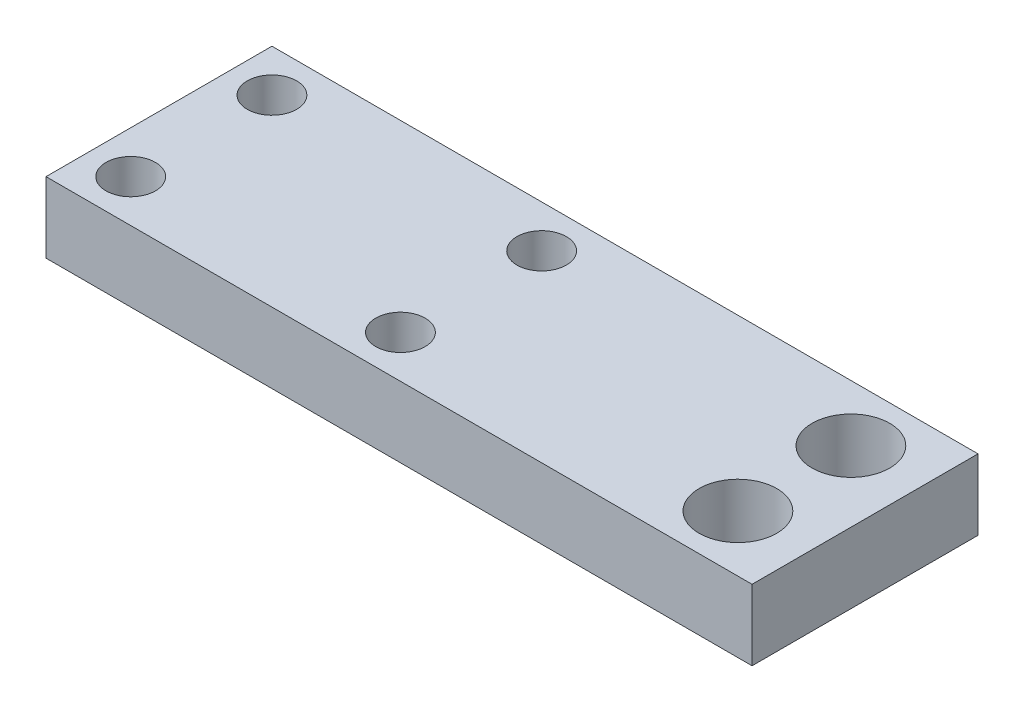
ISO-10303-21;
HEADER;
FILE_DESCRIPTION(('STEP AP214'),'2;1');
FILE_NAME('part.step','',(''),(''),'','','');
FILE_SCHEMA(('AUTOMOTIVE_DESIGN { 1 0 10303 214 1 1 1 1 }'));
ENDSEC;
DATA;
#1=APPLICATION_CONTEXT('core data for automotive mechanical design processes');
#2=APPLICATION_PROTOCOL_DEFINITION('international standard','automotive_design',2000,#1);
#3=PRODUCT_CONTEXT('',#1,'mechanical');
#4=PRODUCT('Part','Part','',(#3));
#5=PRODUCT_RELATED_PRODUCT_CATEGORY('part','',(#4));
#6=PRODUCT_DEFINITION_FORMATION('','',#4);
#7=PRODUCT_DEFINITION_CONTEXT('part definition',#1,'design');
#8=PRODUCT_DEFINITION('design','',#6,#7);
#9=PRODUCT_DEFINITION_SHAPE('','',#8);
#10=(LENGTH_UNIT() NAMED_UNIT(*) SI_UNIT(.MILLI.,.METRE.));
#11=(NAMED_UNIT(*) PLANE_ANGLE_UNIT() SI_UNIT($,.RADIAN.));
#12=(NAMED_UNIT(*) SI_UNIT($,.STERADIAN.) SOLID_ANGLE_UNIT());
#13=UNCERTAINTY_MEASURE_WITH_UNIT(LENGTH_MEASURE(1.E-05),#10,'distance_accuracy_value','');
#14=(GEOMETRIC_REPRESENTATION_CONTEXT(3) GLOBAL_UNCERTAINTY_ASSIGNED_CONTEXT((#13)) GLOBAL_UNIT_ASSIGNED_CONTEXT((#10,
#11,#12)) REPRESENTATION_CONTEXT('',''));
#15=CARTESIAN_POINT('',(0.,0.,0.));
#16=DIRECTION('',(0.,0.,1.));
#17=DIRECTION('',(1.,0.,0.));
#18=AXIS2_PLACEMENT_3D('',#15,#16,#17);
#19=CARTESIAN_POINT('',(0.,5.,0.));
#20=DIRECTION('',(0.,-1.,0.));
#21=DIRECTION('',(0.,0.,-1.));
#22=AXIS2_PLACEMENT_3D('',#19,#20,#21);
#23=PLANE('',#22);
#24=DIRECTION('',(0.,0.,1.));
#25=VECTOR('',#24,1.);
#26=CARTESIAN_POINT('',(-25.,5.,-8.));
#27=LINE('',#26,#25);
#28=CARTESIAN_POINT('',(-25.,5.,-8.));
#29=VERTEX_POINT('',#28);
#30=CARTESIAN_POINT('',(-25.,5.,8.));
#31=VERTEX_POINT('',#30);
#32=EDGE_CURVE('E69',#29,#31,#27,.T.);
#33=ORIENTED_EDGE('',*,*,#32,.T.);
#34=DIRECTION('',(1.,0.,0.));
#35=VECTOR('',#34,1.);
#36=CARTESIAN_POINT('',(25.,5.,8.));
#37=LINE('',#36,#35);
#38=CARTESIAN_POINT('',(25.,5.,8.));
#39=VERTEX_POINT('',#38);
#40=EDGE_CURVE('E64',#31,#39,#37,.T.);
#41=ORIENTED_EDGE('',*,*,#40,.T.);
#42=DIRECTION('',(0.,0.,-1.));
#43=VECTOR('',#42,1.);
#44=CARTESIAN_POINT('',(25.,5.,-8.));
#45=LINE('',#44,#43);
#46=CARTESIAN_POINT('',(25.,5.,-8.));
#47=VERTEX_POINT('',#46);
#48=EDGE_CURVE('E67',#39,#47,#45,.T.);
#49=ORIENTED_EDGE('',*,*,#48,.T.);
#50=DIRECTION('',(-1.,0.,0.));
#51=VECTOR('',#50,1.);
#52=CARTESIAN_POINT('',(25.,5.,-8.));
#53=LINE('',#52,#51);
#54=EDGE_CURVE('E34',#47,#29,#53,.T.);
#55=ORIENTED_EDGE('',*,*,#54,.T.);
#56=EDGE_LOOP('',(#33,#41,#49,#55));
#57=FACE_BOUND('',#56,.T.);
#58=CARTESIAN_POINT('',(20.,5.,4.));
#59=DIRECTION('',(0.,1.,0.));
#60=DIRECTION('',(0.,0.,1.));
#61=AXIS2_PLACEMENT_3D('',#58,#59,#60);
#62=CIRCLE('',#61,2.75);
#63=CARTESIAN_POINT('',(20.,5.,6.75));
#64=VERTEX_POINT('',#63);
#65=EDGE_CURVE('E84',#64,#64,#62,.T.);
#66=ORIENTED_EDGE('',*,*,#65,.F.);
#67=EDGE_LOOP('',(#66));
#68=FACE_BOUND('',#67,.T.);
#69=CARTESIAN_POINT('',(20.,5.,-4.));
#70=DIRECTION('',(0.,1.,0.));
#71=DIRECTION('',(0.,0.,1.));
#72=AXIS2_PLACEMENT_3D('',#69,#70,#71);
#73=CIRCLE('',#72,2.75);
#74=CARTESIAN_POINT('',(20.,5.,-1.25));
#75=VERTEX_POINT('',#74);
#76=EDGE_CURVE('E99',#75,#75,#73,.T.);
#77=ORIENTED_EDGE('',*,*,#76,.F.);
#78=EDGE_LOOP('',(#77));
#79=FACE_BOUND('',#78,.T.);
#80=CARTESIAN_POINT('',(-2.9,5.,5.));
#81=DIRECTION('',(0.,1.,0.));
#82=DIRECTION('',(0.,0.,-1.));
#83=AXIS2_PLACEMENT_3D('',#80,#81,#82);
#84=CIRCLE('',#83,1.75);
#85=CARTESIAN_POINT('',(-2.9,5.,3.25));
#86=VERTEX_POINT('',#85);
#87=EDGE_CURVE('E105',#86,#86,#84,.T.);
#88=ORIENTED_EDGE('',*,*,#87,.F.);
#89=EDGE_LOOP('',(#88));
#90=FACE_BOUND('',#89,.T.);
#91=CARTESIAN_POINT('',(-22.,5.,-5.));
#92=DIRECTION('',(0.,1.,0.));
#93=DIRECTION('',(0.,0.,1.));
#94=AXIS2_PLACEMENT_3D('',#91,#92,#93);
#95=CIRCLE('',#94,1.75);
#96=CARTESIAN_POINT('',(-22.,5.,-3.25));
#97=VERTEX_POINT('',#96);
#98=EDGE_CURVE('E111',#97,#97,#95,.T.);
#99=ORIENTED_EDGE('',*,*,#98,.F.);
#100=EDGE_LOOP('',(#99));
#101=FACE_BOUND('',#100,.T.);
#102=CARTESIAN_POINT('',(-2.9,5.,-5.));
#103=DIRECTION('',(0.,1.,0.));
#104=DIRECTION('',(0.,0.,1.));
#105=AXIS2_PLACEMENT_3D('',#102,#103,#104);
#106=CIRCLE('',#105,1.75);
#107=CARTESIAN_POINT('',(-2.9,5.,-3.25));
#108=VERTEX_POINT('',#107);
#109=EDGE_CURVE('E117',#108,#108,#106,.T.);
#110=ORIENTED_EDGE('',*,*,#109,.F.);
#111=EDGE_LOOP('',(#110));
#112=FACE_BOUND('',#111,.T.);
#113=CARTESIAN_POINT('',(-22.,5.,5.));
#114=DIRECTION('',(0.,1.,0.));
#115=DIRECTION('',(0.,0.,-1.));
#116=AXIS2_PLACEMENT_3D('',#113,#114,#115);
#117=CIRCLE('',#116,1.75);
#118=CARTESIAN_POINT('',(-22.,5.,3.25));
#119=VERTEX_POINT('',#118);
#120=EDGE_CURVE('E123',#119,#119,#117,.T.);
#121=ORIENTED_EDGE('',*,*,#120,.F.);
#122=EDGE_LOOP('',(#121));
#123=FACE_BOUND('',#122,.T.);
#124=ADVANCED_FACE('F17',(#57,#68,#79,#90,#101,#112,#123),#23,.F.);
#125=CARTESIAN_POINT('',(0.,0.,0.));
#126=DIRECTION('',(0.,-1.,0.));
#127=DIRECTION('',(0.,0.,-1.));
#128=AXIS2_PLACEMENT_3D('',#125,#126,#127);
#129=PLANE('',#128);
#130=CARTESIAN_POINT('',(-2.9,0.,-5.));
#131=DIRECTION('',(0.,1.,0.));
#132=DIRECTION('',(0.,0.,1.));
#133=AXIS2_PLACEMENT_3D('',#130,#131,#132);
#134=CIRCLE('',#133,1.75);
#135=CARTESIAN_POINT('',(-2.9,0.,-3.25));
#136=VERTEX_POINT('',#135);
#137=EDGE_CURVE('E120',#136,#136,#134,.T.);
#138=ORIENTED_EDGE('',*,*,#137,.T.);
#139=EDGE_LOOP('',(#138));
#140=FACE_BOUND('',#139,.T.);
#141=CARTESIAN_POINT('',(-2.9,0.,5.));
#142=DIRECTION('',(0.,1.,0.));
#143=DIRECTION('',(0.,0.,-1.));
#144=AXIS2_PLACEMENT_3D('',#141,#142,#143);
#145=CIRCLE('',#144,1.75);
#146=CARTESIAN_POINT('',(-2.9,0.,3.25));
#147=VERTEX_POINT('',#146);
#148=EDGE_CURVE('E108',#147,#147,#145,.T.);
#149=ORIENTED_EDGE('',*,*,#148,.T.);
#150=EDGE_LOOP('',(#149));
#151=FACE_BOUND('',#150,.T.);
#152=CARTESIAN_POINT('',(20.,0.,4.));
#153=DIRECTION('',(0.,1.,0.));
#154=DIRECTION('',(0.,0.,1.));
#155=AXIS2_PLACEMENT_3D('',#152,#153,#154);
#156=CIRCLE('',#155,2.75);
#157=CARTESIAN_POINT('',(20.,0.,6.75));
#158=VERTEX_POINT('',#157);
#159=EDGE_CURVE('E96',#158,#158,#156,.T.);
#160=ORIENTED_EDGE('',*,*,#159,.T.);
#161=EDGE_LOOP('',(#160));
#162=FACE_BOUND('',#161,.T.);
#163=DIRECTION('',(0.,0.,1.));
#164=VECTOR('',#163,1.);
#165=CARTESIAN_POINT('',(-25.,0.,-8.));
#166=LINE('',#165,#164);
#167=CARTESIAN_POINT('',(-25.,0.,-8.));
#168=VERTEX_POINT('',#167);
#169=CARTESIAN_POINT('',(-25.,0.,8.));
#170=VERTEX_POINT('',#169);
#171=EDGE_CURVE('E81',#168,#170,#166,.T.);
#172=ORIENTED_EDGE('',*,*,#171,.F.);
#173=DIRECTION('',(-1.,0.,0.));
#174=VECTOR('',#173,1.);
#175=CARTESIAN_POINT('',(25.,0.,-8.));
#176=LINE('',#175,#174);
#177=CARTESIAN_POINT('',(25.,0.,-8.));
#178=VERTEX_POINT('',#177);
#179=EDGE_CURVE('E57',#178,#168,#176,.T.);
#180=ORIENTED_EDGE('',*,*,#179,.F.);
#181=DIRECTION('',(0.,0.,-1.));
#182=VECTOR('',#181,1.);
#183=CARTESIAN_POINT('',(25.,0.,-8.));
#184=LINE('',#183,#182);
#185=CARTESIAN_POINT('',(25.,0.,8.));
#186=VERTEX_POINT('',#185);
#187=EDGE_CURVE('E51',#186,#178,#184,.T.);
#188=ORIENTED_EDGE('',*,*,#187,.F.);
#189=DIRECTION('',(1.,0.,0.));
#190=VECTOR('',#189,1.);
#191=CARTESIAN_POINT('',(25.,0.,8.));
#192=LINE('',#191,#190);
#193=EDGE_CURVE('E73',#170,#186,#192,.T.);
#194=ORIENTED_EDGE('',*,*,#193,.F.);
#195=EDGE_LOOP('',(#172,#180,#188,#194));
#196=FACE_BOUND('',#195,.T.);
#197=CARTESIAN_POINT('',(20.,0.,-4.));
#198=DIRECTION('',(0.,1.,0.));
#199=DIRECTION('',(0.,0.,1.));
#200=AXIS2_PLACEMENT_3D('',#197,#198,#199);
#201=CIRCLE('',#200,2.75);
#202=CARTESIAN_POINT('',(20.,0.,-1.25));
#203=VERTEX_POINT('',#202);
#204=EDGE_CURVE('E102',#203,#203,#201,.T.);
#205=ORIENTED_EDGE('',*,*,#204,.T.);
#206=EDGE_LOOP('',(#205));
#207=FACE_BOUND('',#206,.T.);
#208=CARTESIAN_POINT('',(-22.,0.,-5.));
#209=DIRECTION('',(0.,1.,0.));
#210=DIRECTION('',(0.,0.,1.));
#211=AXIS2_PLACEMENT_3D('',#208,#209,#210);
#212=CIRCLE('',#211,1.75);
#213=CARTESIAN_POINT('',(-22.,0.,-3.25));
#214=VERTEX_POINT('',#213);
#215=EDGE_CURVE('E114',#214,#214,#212,.T.);
#216=ORIENTED_EDGE('',*,*,#215,.T.);
#217=EDGE_LOOP('',(#216));
#218=FACE_BOUND('',#217,.T.);
#219=CARTESIAN_POINT('',(-22.,0.,5.));
#220=DIRECTION('',(0.,1.,0.));
#221=DIRECTION('',(0.,0.,-1.));
#222=AXIS2_PLACEMENT_3D('',#219,#220,#221);
#223=CIRCLE('',#222,1.75);
#224=CARTESIAN_POINT('',(-22.,0.,3.25));
#225=VERTEX_POINT('',#224);
#226=EDGE_CURVE('E126',#225,#225,#223,.T.);
#227=ORIENTED_EDGE('',*,*,#226,.T.);
#228=EDGE_LOOP('',(#227));
#229=FACE_BOUND('',#228,.T.);
#230=ADVANCED_FACE('F92',(#140,#151,#162,#196,#207,#218,#229),#129,.T.);
#231=CARTESIAN_POINT('',(-25.,5.,-8.));
#232=DIRECTION('',(1.,0.,0.));
#233=DIRECTION('',(0.,0.,-1.));
#234=AXIS2_PLACEMENT_3D('',#231,#232,#233);
#235=PLANE('',#234);
#236=ORIENTED_EDGE('',*,*,#171,.T.);
#237=DIRECTION('',(0.,-1.,0.));
#238=VECTOR('',#237,1.);
#239=CARTESIAN_POINT('',(-25.,5.,8.));
#240=LINE('',#239,#238);
#241=EDGE_CURVE('E11',#31,#170,#240,.T.);
#242=ORIENTED_EDGE('',*,*,#241,.F.);
#243=ORIENTED_EDGE('',*,*,#32,.F.);
#244=DIRECTION('',(0.,-1.,0.));
#245=VECTOR('',#244,1.);
#246=CARTESIAN_POINT('',(-25.,5.,-8.));
#247=LINE('',#246,#245);
#248=EDGE_CURVE('E77',#29,#168,#247,.T.);
#249=ORIENTED_EDGE('',*,*,#248,.T.);
#250=EDGE_LOOP('',(#236,#242,#243,#249));
#251=FACE_BOUND('',#250,.T.);
#252=ADVANCED_FACE('F19',(#251),#235,.F.);
#253=CARTESIAN_POINT('',(25.,5.,8.));
#254=DIRECTION('',(0.,0.,-1.));
#255=DIRECTION('',(-1.,0.,0.));
#256=AXIS2_PLACEMENT_3D('',#253,#254,#255);
#257=PLANE('',#256);
#258=ORIENTED_EDGE('',*,*,#193,.T.);
#259=DIRECTION('',(0.,-1.,0.));
#260=VECTOR('',#259,1.);
#261=CARTESIAN_POINT('',(25.,5.,8.));
#262=LINE('',#261,#260);
#263=EDGE_CURVE('E26',#39,#186,#262,.T.);
#264=ORIENTED_EDGE('',*,*,#263,.F.);
#265=ORIENTED_EDGE('',*,*,#40,.F.);
#266=ORIENTED_EDGE('',*,*,#241,.T.);
#267=EDGE_LOOP('',(#258,#264,#265,#266));
#268=FACE_BOUND('',#267,.T.);
#269=ADVANCED_FACE('F72',(#268),#257,.F.);
#270=CARTESIAN_POINT('',(25.,5.,-8.));
#271=DIRECTION('',(-1.,0.,0.));
#272=DIRECTION('',(0.,0.,1.));
#273=AXIS2_PLACEMENT_3D('',#270,#271,#272);
#274=PLANE('',#273);
#275=ORIENTED_EDGE('',*,*,#187,.T.);
#276=DIRECTION('',(0.,-1.,0.));
#277=VECTOR('',#276,1.);
#278=CARTESIAN_POINT('',(25.,5.,-8.));
#279=LINE('',#278,#277);
#280=EDGE_CURVE('E74',#47,#178,#279,.T.);
#281=ORIENTED_EDGE('',*,*,#280,.F.);
#282=ORIENTED_EDGE('',*,*,#48,.F.);
#283=ORIENTED_EDGE('',*,*,#263,.T.);
#284=EDGE_LOOP('',(#275,#281,#282,#283));
#285=FACE_BOUND('',#284,.T.);
#286=ADVANCED_FACE('F75',(#285),#274,.F.);
#287=CARTESIAN_POINT('',(25.,5.,-8.));
#288=DIRECTION('',(0.,0.,1.));
#289=DIRECTION('',(1.,0.,0.));
#290=AXIS2_PLACEMENT_3D('',#287,#288,#289);
#291=PLANE('',#290);
#292=ORIENTED_EDGE('',*,*,#179,.T.);
#293=ORIENTED_EDGE('',*,*,#248,.F.);
#294=ORIENTED_EDGE('',*,*,#54,.F.);
#295=ORIENTED_EDGE('',*,*,#280,.T.);
#296=EDGE_LOOP('',(#292,#293,#294,#295));
#297=FACE_BOUND('',#296,.T.);
#298=ADVANCED_FACE('F89',(#297),#291,.F.);
#299=CARTESIAN_POINT('',(20.,5.,4.));
#300=DIRECTION('',(0.,-1.,0.));
#301=DIRECTION('',(0.,0.,-1.));
#302=AXIS2_PLACEMENT_3D('',#299,#300,#301);
#303=CYLINDRICAL_SURFACE('',#302,2.75);
#304=ORIENTED_EDGE('',*,*,#65,.T.);
#305=EDGE_LOOP('',(#304));
#306=FACE_BOUND('',#305,.T.);
#307=ORIENTED_EDGE('',*,*,#159,.F.);
#308=EDGE_LOOP('',(#307));
#309=FACE_BOUND('',#308,.T.);
#310=ADVANCED_FACE('F145',(#306,#309),#303,.F.);
#311=CARTESIAN_POINT('',(20.,5.,-4.));
#312=DIRECTION('',(0.,-1.,0.));
#313=DIRECTION('',(0.,0.,-1.));
#314=AXIS2_PLACEMENT_3D('',#311,#312,#313);
#315=CYLINDRICAL_SURFACE('',#314,2.75);
#316=ORIENTED_EDGE('',*,*,#76,.T.);
#317=EDGE_LOOP('',(#316));
#318=FACE_BOUND('',#317,.T.);
#319=ORIENTED_EDGE('',*,*,#204,.F.);
#320=EDGE_LOOP('',(#319));
#321=FACE_BOUND('',#320,.T.);
#322=ADVANCED_FACE('F194',(#318,#321),#315,.F.);
#323=CARTESIAN_POINT('',(-2.9,5.,5.));
#324=DIRECTION('',(0.,-1.,0.));
#325=DIRECTION('',(0.,0.,-1.));
#326=AXIS2_PLACEMENT_3D('',#323,#324,#325);
#327=CYLINDRICAL_SURFACE('',#326,1.75);
#328=ORIENTED_EDGE('',*,*,#87,.T.);
#329=EDGE_LOOP('',(#328));
#330=FACE_BOUND('',#329,.T.);
#331=ORIENTED_EDGE('',*,*,#148,.F.);
#332=EDGE_LOOP('',(#331));
#333=FACE_BOUND('',#332,.T.);
#334=ADVANCED_FACE('F201',(#330,#333),#327,.F.);
#335=CARTESIAN_POINT('',(-22.,5.,-5.));
#336=DIRECTION('',(0.,-1.,0.));
#337=DIRECTION('',(0.,0.,-1.));
#338=AXIS2_PLACEMENT_3D('',#335,#336,#337);
#339=CYLINDRICAL_SURFACE('',#338,1.75);
#340=ORIENTED_EDGE('',*,*,#98,.T.);
#341=EDGE_LOOP('',(#340));
#342=FACE_BOUND('',#341,.T.);
#343=ORIENTED_EDGE('',*,*,#215,.F.);
#344=EDGE_LOOP('',(#343));
#345=FACE_BOUND('',#344,.T.);
#346=ADVANCED_FACE('F208',(#342,#345),#339,.F.);
#347=CARTESIAN_POINT('',(-2.9,5.,-5.));
#348=DIRECTION('',(0.,-1.,0.));
#349=DIRECTION('',(0.,0.,-1.));
#350=AXIS2_PLACEMENT_3D('',#347,#348,#349);
#351=CYLINDRICAL_SURFACE('',#350,1.75);
#352=ORIENTED_EDGE('',*,*,#109,.T.);
#353=EDGE_LOOP('',(#352));
#354=FACE_BOUND('',#353,.T.);
#355=ORIENTED_EDGE('',*,*,#137,.F.);
#356=EDGE_LOOP('',(#355));
#357=FACE_BOUND('',#356,.T.);
#358=ADVANCED_FACE('F216',(#354,#357),#351,.F.);
#359=CARTESIAN_POINT('',(-22.,5.,5.));
#360=DIRECTION('',(0.,-1.,0.));
#361=DIRECTION('',(0.,0.,-1.));
#362=AXIS2_PLACEMENT_3D('',#359,#360,#361);
#363=CYLINDRICAL_SURFACE('',#362,1.75);
#364=ORIENTED_EDGE('',*,*,#120,.T.);
#365=EDGE_LOOP('',(#364));
#366=FACE_BOUND('',#365,.T.);
#367=ORIENTED_EDGE('',*,*,#226,.F.);
#368=EDGE_LOOP('',(#367));
#369=FACE_BOUND('',#368,.T.);
#370=ADVANCED_FACE('F132',(#366,#369),#363,.F.);
#371=CLOSED_SHELL('',(#124,#230,#252,#269,#286,#298,#310,#322,#334,#346,#358,#370));
#372=MANIFOLD_SOLID_BREP('B1',#371);
#373=ADVANCED_BREP_SHAPE_REPRESENTATION('',(#18,#372),#14);
#374=SHAPE_DEFINITION_REPRESENTATION(#9,#373);
ENDSEC;
END-ISO-10303-21;
